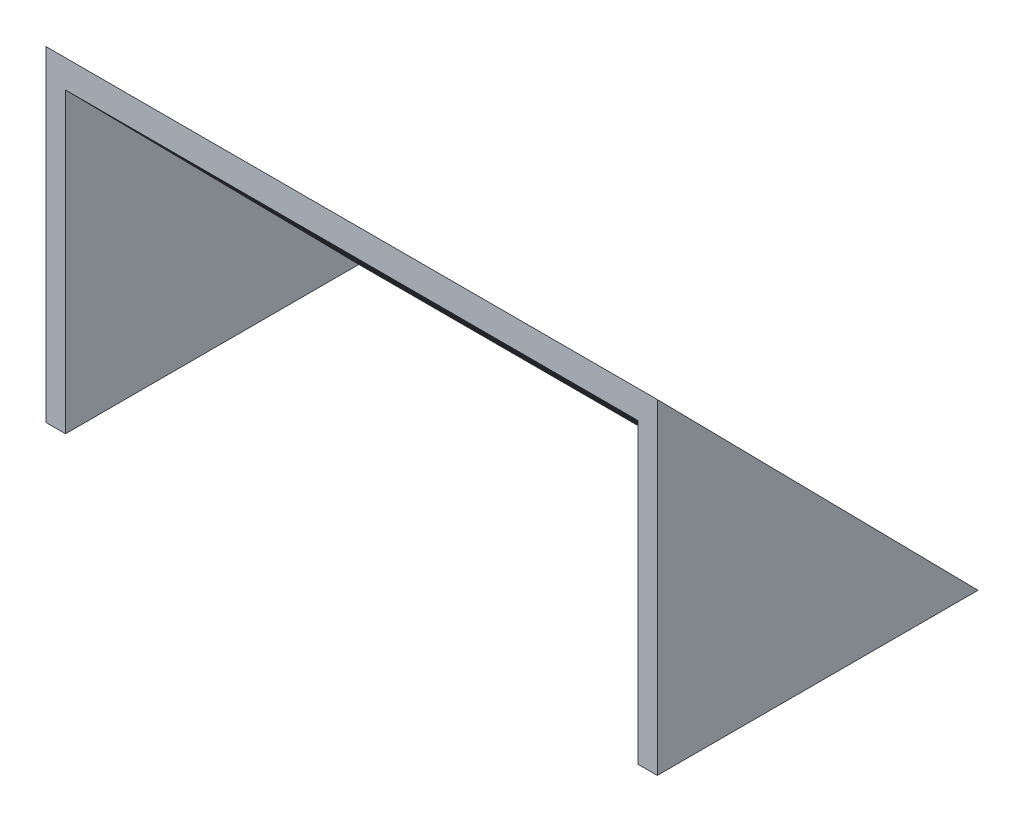
ISO-10303-21;
HEADER;
FILE_DESCRIPTION(('STEP AP214'),'2;1');
FILE_NAME('part.step','',(''),(''),'','','');
FILE_SCHEMA(('AUTOMOTIVE_DESIGN { 1 0 10303 214 1 1 1 1 }'));
ENDSEC;
DATA;
#1=APPLICATION_CONTEXT('core data for automotive mechanical design processes');
#2=APPLICATION_PROTOCOL_DEFINITION('international standard','automotive_design',2000,#1);
#3=PRODUCT_CONTEXT('',#1,'mechanical');
#4=PRODUCT('Part','Part','',(#3));
#5=PRODUCT_RELATED_PRODUCT_CATEGORY('part','',(#4));
#6=PRODUCT_DEFINITION_FORMATION('','',#4);
#7=PRODUCT_DEFINITION_CONTEXT('part definition',#1,'design');
#8=PRODUCT_DEFINITION('design','',#6,#7);
#9=PRODUCT_DEFINITION_SHAPE('','',#8);
#10=(LENGTH_UNIT() NAMED_UNIT(*) SI_UNIT(.MILLI.,.METRE.));
#11=(NAMED_UNIT(*) PLANE_ANGLE_UNIT() SI_UNIT($,.RADIAN.));
#12=(NAMED_UNIT(*) SI_UNIT($,.STERADIAN.) SOLID_ANGLE_UNIT());
#13=UNCERTAINTY_MEASURE_WITH_UNIT(LENGTH_MEASURE(1.E-05),#10,'distance_accuracy_value','');
#14=(GEOMETRIC_REPRESENTATION_CONTEXT(3) GLOBAL_UNCERTAINTY_ASSIGNED_CONTEXT((#13)) GLOBAL_UNIT_ASSIGNED_CONTEXT((#10,
#11,#12)) REPRESENTATION_CONTEXT('',''));
#15=CARTESIAN_POINT('',(0.,0.,0.));
#16=DIRECTION('',(0.,0.,1.));
#17=DIRECTION('',(1.,0.,0.));
#18=AXIS2_PLACEMENT_3D('',#15,#16,#17);
#19=CARTESIAN_POINT('',(1.2,0.,-19.7));
#20=DIRECTION('',(0.,1.,0.));
#21=DIRECTION('',(0.,0.,1.));
#22=AXIS2_PLACEMENT_3D('',#19,#20,#21);
#23=PLANE('',#22);
#24=DIRECTION('',(0.,0.,-1.));
#25=VECTOR('',#24,1.);
#26=CARTESIAN_POINT('',(0.,0.,-19.7));
#27=LINE('',#26,#25);
#28=CARTESIAN_POINT('',(0.,0.,0.));
#29=VERTEX_POINT('',#28);
#30=CARTESIAN_POINT('',(0.,0.,-19.7));
#31=VERTEX_POINT('',#30);
#32=EDGE_CURVE('E218',#29,#31,#27,.T.);
#33=ORIENTED_EDGE('',*,*,#32,.T.);
#34=DIRECTION('',(-1.,0.,0.));
#35=VECTOR('',#34,1.);
#36=CARTESIAN_POINT('',(1.2,0.,-19.7));
#37=LINE('',#36,#35);
#38=CARTESIAN_POINT('',(37.55,0.,-19.7));
#39=VERTEX_POINT('',#38);
#40=EDGE_CURVE('E42',#39,#31,#37,.T.);
#41=ORIENTED_EDGE('',*,*,#40,.F.);
#42=DIRECTION('',(0.,0.,-1.));
#43=VECTOR('',#42,1.);
#44=CARTESIAN_POINT('',(37.55,0.,-19.7));
#45=LINE('',#44,#43);
#46=CARTESIAN_POINT('',(37.55,0.,0.));
#47=VERTEX_POINT('',#46);
#48=EDGE_CURVE('E203',#47,#39,#45,.T.);
#49=ORIENTED_EDGE('',*,*,#48,.F.);
#50=DIRECTION('',(-1.,0.,0.));
#51=VECTOR('',#50,1.);
#52=CARTESIAN_POINT('',(37.55,0.,0.));
#53=LINE('',#52,#51);
#54=CARTESIAN_POINT('',(36.35,0.,0.));
#55=VERTEX_POINT('',#54);
#56=EDGE_CURVE('E213',#47,#55,#53,.T.);
#57=ORIENTED_EDGE('',*,*,#56,.T.);
#58=DIRECTION('',(0.,0.,-1.));
#59=VECTOR('',#58,1.);
#60=CARTESIAN_POINT('',(36.35,0.,-19.7));
#61=LINE('',#60,#59);
#62=CARTESIAN_POINT('',(36.35,0.,-18.0156235575145));
#63=VERTEX_POINT('',#62);
#64=EDGE_CURVE('E55',#55,#63,#61,.T.);
#65=ORIENTED_EDGE('',*,*,#64,.T.);
#66=DIRECTION('',(-1.,0.,0.));
#67=VECTOR('',#66,1.);
#68=CARTESIAN_POINT('',(0.,0.,-18.0156235575145));
#69=LINE('',#68,#67);
#70=CARTESIAN_POINT('',(1.2,0.,-18.0156235575145));
#71=VERTEX_POINT('',#70);
#72=EDGE_CURVE('E103',#63,#71,#69,.T.);
#73=ORIENTED_EDGE('',*,*,#72,.T.);
#74=DIRECTION('',(0.,0.,-1.));
#75=VECTOR('',#74,1.);
#76=CARTESIAN_POINT('',(1.2,0.,-19.7));
#77=LINE('',#76,#75);
#78=CARTESIAN_POINT('',(1.2,0.,0.));
#79=VERTEX_POINT('',#78);
#80=EDGE_CURVE('E94',#79,#71,#77,.T.);
#81=ORIENTED_EDGE('',*,*,#80,.F.);
#82=DIRECTION('',(-1.,0.,0.));
#83=VECTOR('',#82,1.);
#84=CARTESIAN_POINT('',(1.2,0.,0.));
#85=LINE('',#84,#83);
#86=EDGE_CURVE('E222',#79,#29,#85,.T.);
#87=ORIENTED_EDGE('',*,*,#86,.T.);
#88=EDGE_LOOP('',(#33,#41,#49,#57,#65,#73,#81,#87));
#89=FACE_BOUND('',#88,.T.);
#90=ADVANCED_FACE('F39',(#89),#23,.F.);
#91=CARTESIAN_POINT('',(1.2,20.,0.));
#92=DIRECTION('',(0.,-0.701743369347911,0.712429816596864));
#93=DIRECTION('',(0.,-0.712429816596864,-0.701743369347911));
#94=AXIS2_PLACEMENT_3D('',#91,#92,#93);
#95=PLANE('',#94);
#96=DIRECTION('',(0.,0.712429816596864,0.701743369347911));
#97=VECTOR('',#96,1.);
#98=CARTESIAN_POINT('',(0.,20.,0.));
#99=LINE('',#98,#97);
#100=CARTESIAN_POINT('',(0.,20.,0.));
#101=VERTEX_POINT('',#100);
#102=EDGE_CURVE('E225',#31,#101,#99,.T.);
#103=ORIENTED_EDGE('',*,*,#102,.T.);
#104=DIRECTION('',(-1.,0.,0.));
#105=VECTOR('',#104,1.);
#106=CARTESIAN_POINT('',(1.2,20.,0.));
#107=LINE('',#106,#105);
#108=CARTESIAN_POINT('',(37.55,20.,0.));
#109=VERTEX_POINT('',#108);
#110=EDGE_CURVE('E231',#109,#101,#107,.T.);
#111=ORIENTED_EDGE('',*,*,#110,.F.);
#112=DIRECTION('',(0.,0.712429816596864,0.701743369347911));
#113=VECTOR('',#112,1.);
#114=CARTESIAN_POINT('',(37.55,20.,0.));
#115=LINE('',#114,#113);
#116=EDGE_CURVE('E208',#39,#109,#115,.T.);
#117=ORIENTED_EDGE('',*,*,#116,.F.);
#118=ORIENTED_EDGE('',*,*,#40,.T.);
#119=EDGE_LOOP('',(#103,#111,#117,#118));
#120=FACE_BOUND('',#119,.T.);
#121=ADVANCED_FACE('F124',(#120),#95,.F.);
#122=CARTESIAN_POINT('',(1.2,0.,0.));
#123=DIRECTION('',(0.,0.,-1.));
#124=DIRECTION('',(-1.,0.,0.));
#125=AXIS2_PLACEMENT_3D('',#122,#123,#124);
#126=PLANE('',#125);
#127=ORIENTED_EDGE('',*,*,#86,.F.);
#128=DIRECTION('',(0.,-1.,0.));
#129=VECTOR('',#128,1.);
#130=CARTESIAN_POINT('',(1.2,0.,0.));
#131=LINE('',#130,#129);
#132=CARTESIAN_POINT('',(1.2,18.2899731548371,0.));
#133=VERTEX_POINT('',#132);
#134=EDGE_CURVE('E97',#133,#79,#131,.T.);
#135=ORIENTED_EDGE('',*,*,#134,.F.);
#136=DIRECTION('',(1.,0.,0.));
#137=VECTOR('',#136,1.);
#138=CARTESIAN_POINT('',(0.,18.2899731548371,0.));
#139=LINE('',#138,#137);
#140=CARTESIAN_POINT('',(36.35,18.2899731548371,0.));
#141=VERTEX_POINT('',#140);
#142=EDGE_CURVE('E63',#133,#141,#139,.T.);
#143=ORIENTED_EDGE('',*,*,#142,.T.);
#144=DIRECTION('',(0.,-1.,0.));
#145=VECTOR('',#144,1.);
#146=CARTESIAN_POINT('',(36.35,0.,0.));
#147=LINE('',#146,#145);
#148=EDGE_CURVE('E199',#141,#55,#147,.T.);
#149=ORIENTED_EDGE('',*,*,#148,.T.);
#150=ORIENTED_EDGE('',*,*,#56,.F.);
#151=DIRECTION('',(0.,-1.,0.));
#152=VECTOR('',#151,1.);
#153=CARTESIAN_POINT('',(37.55,0.,0.));
#154=LINE('',#153,#152);
#155=EDGE_CURVE('E215',#109,#47,#154,.T.);
#156=ORIENTED_EDGE('',*,*,#155,.F.);
#157=ORIENTED_EDGE('',*,*,#110,.T.);
#158=DIRECTION('',(0.,-1.,0.));
#159=VECTOR('',#158,1.);
#160=CARTESIAN_POINT('',(0.,0.,0.));
#161=LINE('',#160,#159);
#162=EDGE_CURVE('E101',#101,#29,#161,.T.);
#163=ORIENTED_EDGE('',*,*,#162,.T.);
#164=EDGE_LOOP('',(#127,#135,#143,#149,#150,#156,#157,#163));
#165=FACE_BOUND('',#164,.T.);
#166=ADVANCED_FACE('F128',(#165),#126,.F.);
#167=CARTESIAN_POINT('',(1.2,0.,0.));
#168=DIRECTION('',(-1.,0.,0.));
#169=DIRECTION('',(0.,0.,1.));
#170=AXIS2_PLACEMENT_3D('',#167,#168,#169);
#171=PLANE('',#170);
#172=ORIENTED_EDGE('',*,*,#80,.T.);
#173=DIRECTION('',(0.,0.712429816596864,0.701743369347911));
#174=VECTOR('',#173,1.);
#175=CARTESIAN_POINT('',(1.2,19.1579079567825,0.854915779916235));
#176=LINE('',#175,#174);
#177=EDGE_CURVE('E11',#71,#133,#176,.T.);
#178=ORIENTED_EDGE('',*,*,#177,.T.);
#179=ORIENTED_EDGE('',*,*,#134,.T.);
#180=EDGE_LOOP('',(#172,#178,#179));
#181=FACE_BOUND('',#180,.T.);
#182=ADVANCED_FACE('F95',(#181),#171,.F.);
#183=CARTESIAN_POINT('',(0.,0.,0.));
#184=DIRECTION('',(-1.,0.,0.));
#185=DIRECTION('',(0.,0.,1.));
#186=AXIS2_PLACEMENT_3D('',#183,#184,#185);
#187=PLANE('',#186);
#188=ORIENTED_EDGE('',*,*,#32,.F.);
#189=ORIENTED_EDGE('',*,*,#162,.F.);
#190=ORIENTED_EDGE('',*,*,#102,.F.);
#191=EDGE_LOOP('',(#188,#189,#190));
#192=FACE_BOUND('',#191,.T.);
#193=ADVANCED_FACE('F110',(#192),#187,.T.);
#194=CARTESIAN_POINT('',(0.,9.00678308525769,-9.14394221853572));
#195=DIRECTION('',(0.,-0.701743369347911,0.712429816596864));
#196=DIRECTION('',(0.,-0.712429816596864,-0.701743369347911));
#197=AXIS2_PLACEMENT_3D('',#194,#195,#196);
#198=PLANE('',#197);
#199=ORIENTED_EDGE('',*,*,#142,.F.);
#200=ORIENTED_EDGE('',*,*,#177,.F.);
#201=ORIENTED_EDGE('',*,*,#72,.F.);
#202=DIRECTION('',(0.,-0.712429816596864,-0.701743369347911));
#203=VECTOR('',#202,1.);
#204=CARTESIAN_POINT('',(36.35,19.1579079567825,0.854915779916232));
#205=LINE('',#204,#203);
#206=EDGE_CURVE('E200',#141,#63,#205,.T.);
#207=ORIENTED_EDGE('',*,*,#206,.F.);
#208=EDGE_LOOP('',(#199,#200,#201,#207));
#209=FACE_BOUND('',#208,.T.);
#210=ADVANCED_FACE('F107',(#209),#198,.T.);
#211=CARTESIAN_POINT('',(37.55,0.,0.));
#212=DIRECTION('',(-1.,0.,0.));
#213=DIRECTION('',(0.,0.,1.));
#214=AXIS2_PLACEMENT_3D('',#211,#212,#213);
#215=PLANE('',#214);
#216=ORIENTED_EDGE('',*,*,#48,.T.);
#217=ORIENTED_EDGE('',*,*,#116,.T.);
#218=ORIENTED_EDGE('',*,*,#155,.T.);
#219=EDGE_LOOP('',(#216,#217,#218));
#220=FACE_BOUND('',#219,.T.);
#221=ADVANCED_FACE('F109',(#220),#215,.F.);
#222=CARTESIAN_POINT('',(36.35,0.,0.));
#223=DIRECTION('',(-1.,0.,0.));
#224=DIRECTION('',(0.,0.,1.));
#225=AXIS2_PLACEMENT_3D('',#222,#223,#224);
#226=PLANE('',#225);
#227=ORIENTED_EDGE('',*,*,#148,.F.);
#228=ORIENTED_EDGE('',*,*,#206,.T.);
#229=ORIENTED_EDGE('',*,*,#64,.F.);
#230=EDGE_LOOP('',(#227,#228,#229));
#231=FACE_BOUND('',#230,.T.);
#232=ADVANCED_FACE('F116',(#231),#226,.T.);
#233=CLOSED_SHELL('',(#90,#121,#166,#182,#193,#210,#221,#232));
#234=MANIFOLD_SOLID_BREP('B2',#233);
#235=ADVANCED_BREP_SHAPE_REPRESENTATION('',(#18,#234),#14);
#236=SHAPE_DEFINITION_REPRESENTATION(#9,#235);
ENDSEC;
END-ISO-10303-21;
